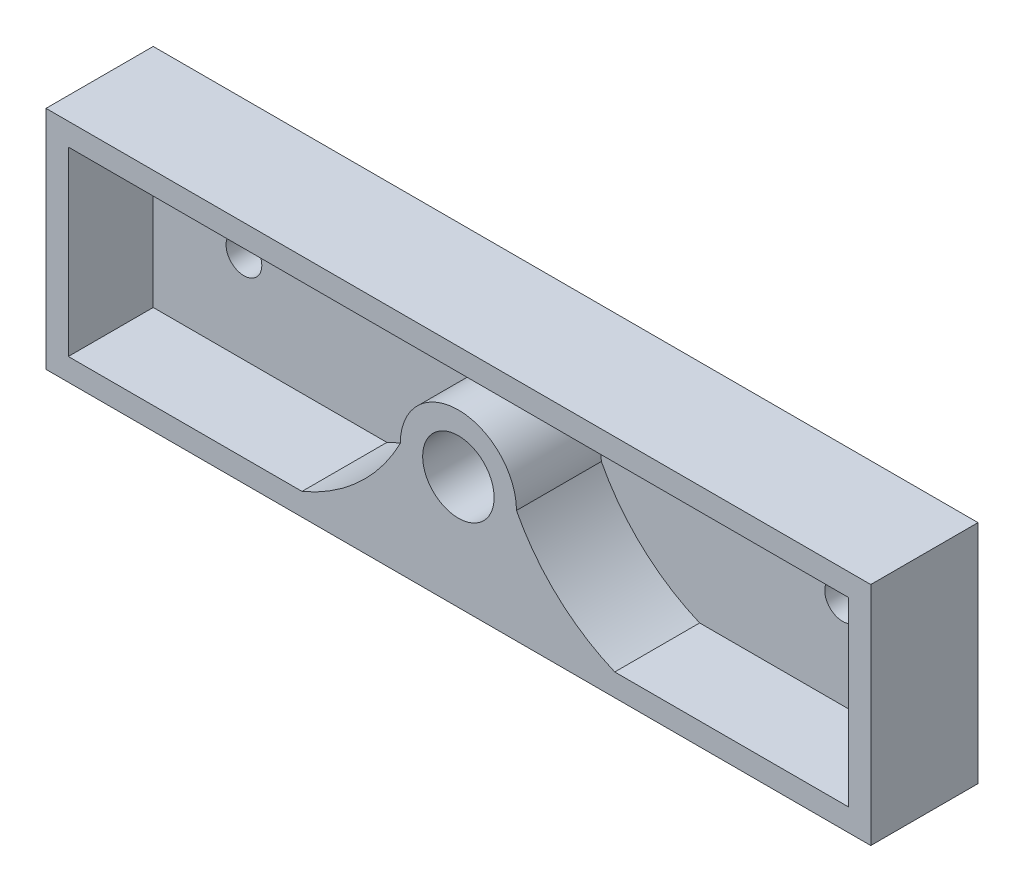
ISO-10303-21;
HEADER;
FILE_DESCRIPTION(('STEP AP214'),'2;1');
FILE_NAME('part.step','',(''),(''),'','','');
FILE_SCHEMA(('AUTOMOTIVE_DESIGN { 1 0 10303 214 1 1 1 1 }'));
ENDSEC;
DATA;
#1=APPLICATION_CONTEXT('core data for automotive mechanical design processes');
#2=APPLICATION_PROTOCOL_DEFINITION('international standard','automotive_design',2000,#1);
#3=PRODUCT_CONTEXT('',#1,'mechanical');
#4=PRODUCT('Part','Part','',(#3));
#5=PRODUCT_RELATED_PRODUCT_CATEGORY('part','',(#4));
#6=PRODUCT_DEFINITION_FORMATION('','',#4);
#7=PRODUCT_DEFINITION_CONTEXT('part definition',#1,'design');
#8=PRODUCT_DEFINITION('design','',#6,#7);
#9=PRODUCT_DEFINITION_SHAPE('','',#8);
#10=(LENGTH_UNIT() NAMED_UNIT(*) SI_UNIT(.MILLI.,.METRE.));
#11=(NAMED_UNIT(*) PLANE_ANGLE_UNIT() SI_UNIT($,.RADIAN.));
#12=(NAMED_UNIT(*) SI_UNIT($,.STERADIAN.) SOLID_ANGLE_UNIT());
#13=UNCERTAINTY_MEASURE_WITH_UNIT(LENGTH_MEASURE(1.E-05),#10,'distance_accuracy_value','');
#14=(GEOMETRIC_REPRESENTATION_CONTEXT(3) GLOBAL_UNCERTAINTY_ASSIGNED_CONTEXT((#13)) GLOBAL_UNIT_ASSIGNED_CONTEXT((#10,
#11,#12)) REPRESENTATION_CONTEXT('',''));
#15=CARTESIAN_POINT('',(0.,0.,0.));
#16=DIRECTION('',(0.,0.,1.));
#17=DIRECTION('',(1.,0.,0.));
#18=AXIS2_PLACEMENT_3D('',#15,#16,#17);
#19=CARTESIAN_POINT('',(0.,2.5,12.));
#20=DIRECTION('',(0.,1.,0.));
#21=DIRECTION('',(0.,0.,1.));
#22=AXIS2_PLACEMENT_3D('',#19,#20,#21);
#23=PLANE('',#22);
#24=DIRECTION('',(1.,0.,0.));
#25=VECTOR('',#24,1.);
#26=CARTESIAN_POINT('',(0.,2.5,2.5));
#27=LINE('',#26,#25);
#28=CARTESIAN_POINT('',(63.65,2.5,2.5));
#29=VERTEX_POINT('',#28);
#30=CARTESIAN_POINT('',(89.8,2.5,2.5));
#31=VERTEX_POINT('',#30);
#32=EDGE_CURVE('E178',#29,#31,#27,.T.);
#33=ORIENTED_EDGE('',*,*,#32,.F.);
#34=DIRECTION('',(0.,0.,-1.));
#35=VECTOR('',#34,1.);
#36=CARTESIAN_POINT('',(63.65,2.5,50.7585151934385));
#37=LINE('',#36,#35);
#38=CARTESIAN_POINT('',(63.65,2.5,12.));
#39=VERTEX_POINT('',#38);
#40=EDGE_CURVE('E50',#39,#29,#37,.T.);
#41=ORIENTED_EDGE('',*,*,#40,.F.);
#42=DIRECTION('',(1.,0.,0.));
#43=VECTOR('',#42,1.);
#44=CARTESIAN_POINT('',(0.,2.5,12.));
#45=LINE('',#44,#43);
#46=CARTESIAN_POINT('',(89.8,2.5,12.));
#47=VERTEX_POINT('',#46);
#48=EDGE_CURVE('E201',#39,#47,#45,.T.);
#49=ORIENTED_EDGE('',*,*,#48,.T.);
#50=DIRECTION('',(0.,0.,-1.));
#51=VECTOR('',#50,1.);
#52=CARTESIAN_POINT('',(89.8,2.5,12.));
#53=LINE('',#52,#51);
#54=EDGE_CURVE('E183',#47,#31,#53,.T.);
#55=ORIENTED_EDGE('',*,*,#54,.T.);
#56=EDGE_LOOP('',(#33,#41,#49,#55));
#57=FACE_BOUND('',#56,.T.);
#58=ADVANCED_FACE('F35',(#57),#23,.T.);
#59=CARTESIAN_POINT('',(2.5,2.5,12.));
#60=VERTEX_POINT('',#59);
#61=CARTESIAN_POINT('',(28.65,2.5,12.));
#62=VERTEX_POINT('',#61);
#63=EDGE_CURVE('E58',#60,#62,#45,.T.);
#64=ORIENTED_EDGE('',*,*,#63,.T.);
#65=DIRECTION('',(0.,0.,-1.));
#66=VECTOR('',#65,1.);
#67=CARTESIAN_POINT('',(28.65,2.5,50.7585151934385));
#68=LINE('',#67,#66);
#69=CARTESIAN_POINT('',(28.65,2.5,2.5));
#70=VERTEX_POINT('',#69);
#71=EDGE_CURVE('E152',#62,#70,#68,.T.);
#72=ORIENTED_EDGE('',*,*,#71,.T.);
#73=CARTESIAN_POINT('',(2.5,2.5,2.5));
#74=VERTEX_POINT('',#73);
#75=EDGE_CURVE('E189',#74,#70,#27,.T.);
#76=ORIENTED_EDGE('',*,*,#75,.F.);
#77=DIRECTION('',(0.,0.,-1.));
#78=VECTOR('',#77,1.);
#79=CARTESIAN_POINT('',(2.5,2.5,12.));
#80=LINE('',#79,#78);
#81=EDGE_CURVE('E179',#60,#74,#80,.T.);
#82=ORIENTED_EDGE('',*,*,#81,.F.);
#83=EDGE_LOOP('',(#64,#72,#76,#82));
#84=FACE_BOUND('',#83,.T.);
#85=ADVANCED_FACE('F257',(#84),#23,.T.);
#86=CARTESIAN_POINT('',(0.,0.,2.5));
#87=DIRECTION('',(0.,0.,-1.));
#88=DIRECTION('',(-1.,0.,0.));
#89=AXIS2_PLACEMENT_3D('',#86,#87,#88);
#90=PLANE('',#89);
#91=CARTESIAN_POINT('',(12.65,12.65,2.5));
#92=DIRECTION('',(0.,0.,1.));
#93=DIRECTION('',(1.,0.,0.));
#94=AXIS2_PLACEMENT_3D('',#91,#92,#93);
#95=CIRCLE('',#94,2.);
#96=CARTESIAN_POINT('',(14.65,12.65,2.5));
#97=VERTEX_POINT('',#96);
#98=EDGE_CURVE('E161',#97,#97,#95,.T.);
#99=ORIENTED_EDGE('',*,*,#98,.F.);
#100=EDGE_LOOP('',(#99));
#101=FACE_BOUND('',#100,.T.);
#102=CARTESIAN_POINT('',(79.65,12.65,2.5));
#103=DIRECTION('',(0.,0.,1.));
#104=DIRECTION('',(1.,0.,0.));
#105=AXIS2_PLACEMENT_3D('',#102,#103,#104);
#106=CIRCLE('',#105,2.);
#107=CARTESIAN_POINT('',(81.65,12.65,2.5));
#108=VERTEX_POINT('',#107);
#109=EDGE_CURVE('E160',#108,#108,#106,.T.);
#110=ORIENTED_EDGE('',*,*,#109,.F.);
#111=EDGE_LOOP('',(#110));
#112=FACE_BOUND('',#111,.T.);
#113=CARTESIAN_POINT('',(72.1502292013453,22.7476621886501,2.5));
#114=DIRECTION('',(0.,0.,-1.));
#115=DIRECTION('',(1.,0.,0.));
#116=AXIS2_PLACEMENT_3D('',#113,#114,#115);
#117=CIRCLE('',#116,21.9595473674002);
#118=CARTESIAN_POINT('',(52.65,12.65,2.5));
#119=VERTEX_POINT('',#118);
#120=EDGE_CURVE('E140',#29,#119,#117,.T.);
#121=ORIENTED_EDGE('',*,*,#120,.F.);
#122=ORIENTED_EDGE('',*,*,#32,.T.);
#123=DIRECTION('',(0.,1.,0.));
#124=VECTOR('',#123,1.);
#125=CARTESIAN_POINT('',(89.8,0.,2.5));
#126=LINE('',#125,#124);
#127=CARTESIAN_POINT('',(89.8,22.8,2.5));
#128=VERTEX_POINT('',#127);
#129=EDGE_CURVE('E191',#31,#128,#126,.T.);
#130=ORIENTED_EDGE('',*,*,#129,.T.);
#131=DIRECTION('',(-1.,0.,0.));
#132=VECTOR('',#131,1.);
#133=CARTESIAN_POINT('',(0.,22.8,2.5));
#134=LINE('',#133,#132);
#135=CARTESIAN_POINT('',(2.5,22.8,2.5));
#136=VERTEX_POINT('',#135);
#137=EDGE_CURVE('E195',#128,#136,#134,.T.);
#138=ORIENTED_EDGE('',*,*,#137,.T.);
#139=DIRECTION('',(0.,-1.,0.));
#140=VECTOR('',#139,1.);
#141=CARTESIAN_POINT('',(2.5,0.,2.5));
#142=LINE('',#141,#140);
#143=EDGE_CURVE('E175',#136,#74,#142,.T.);
#144=ORIENTED_EDGE('',*,*,#143,.T.);
#145=ORIENTED_EDGE('',*,*,#75,.T.);
#146=CARTESIAN_POINT('',(20.1497707986547,22.7476621886501,2.5));
#147=DIRECTION('',(0.,0.,-1.));
#148=DIRECTION('',(-1.,0.,0.));
#149=AXIS2_PLACEMENT_3D('',#146,#147,#148);
#150=CIRCLE('',#149,21.9595473674002);
#151=CARTESIAN_POINT('',(39.65,12.65,2.5));
#152=VERTEX_POINT('',#151);
#153=EDGE_CURVE('E149',#152,#70,#150,.T.);
#154=ORIENTED_EDGE('',*,*,#153,.F.);
#155=CARTESIAN_POINT('',(46.15,12.65,2.5));
#156=DIRECTION('',(0.,0.,1.));
#157=DIRECTION('',(1.,0.,0.));
#158=AXIS2_PLACEMENT_3D('',#155,#156,#157);
#159=CIRCLE('',#158,6.5);
#160=EDGE_CURVE('E146',#119,#152,#159,.T.);
#161=ORIENTED_EDGE('',*,*,#160,.F.);
#162=EDGE_LOOP('',(#121,#122,#130,#138,#144,#145,#154,#161));
#163=FACE_BOUND('',#162,.T.);
#164=ADVANCED_FACE('F262',(#101,#112,#163),#90,.F.);
#165=CARTESIAN_POINT('',(0.,0.,12.));
#166=DIRECTION('',(0.,0.,-1.));
#167=DIRECTION('',(-1.,0.,0.));
#168=AXIS2_PLACEMENT_3D('',#165,#166,#167);
#169=PLANE('',#168);
#170=DIRECTION('',(0.,-1.,0.));
#171=VECTOR('',#170,1.);
#172=CARTESIAN_POINT('',(0.,0.,12.));
#173=LINE('',#172,#171);
#174=CARTESIAN_POINT('',(0.,25.3,12.));
#175=VERTEX_POINT('',#174);
#176=CARTESIAN_POINT('',(0.,0.,12.));
#177=VERTEX_POINT('',#176);
#178=EDGE_CURVE('E207',#175,#177,#173,.T.);
#179=ORIENTED_EDGE('',*,*,#178,.T.);
#180=DIRECTION('',(1.,0.,0.));
#181=VECTOR('',#180,1.);
#182=CARTESIAN_POINT('',(0.,0.,12.));
#183=LINE('',#182,#181);
#184=CARTESIAN_POINT('',(92.3,0.,12.));
#185=VERTEX_POINT('',#184);
#186=EDGE_CURVE('E210',#177,#185,#183,.T.);
#187=ORIENTED_EDGE('',*,*,#186,.T.);
#188=DIRECTION('',(0.,1.,0.));
#189=VECTOR('',#188,1.);
#190=CARTESIAN_POINT('',(92.3,0.,12.));
#191=LINE('',#190,#189);
#192=CARTESIAN_POINT('',(92.3,25.3,12.));
#193=VERTEX_POINT('',#192);
#194=EDGE_CURVE('E213',#185,#193,#191,.T.);
#195=ORIENTED_EDGE('',*,*,#194,.T.);
#196=DIRECTION('',(-1.,0.,0.));
#197=VECTOR('',#196,1.);
#198=CARTESIAN_POINT('',(0.,25.3,12.));
#199=LINE('',#198,#197);
#200=EDGE_CURVE('E215',#193,#175,#199,.T.);
#201=ORIENTED_EDGE('',*,*,#200,.T.);
#202=EDGE_LOOP('',(#179,#187,#195,#201));
#203=FACE_BOUND('',#202,.T.);
#204=DIRECTION('',(0.,-1.,0.));
#205=VECTOR('',#204,1.);
#206=CARTESIAN_POINT('',(2.5,0.,12.));
#207=LINE('',#206,#205);
#208=CARTESIAN_POINT('',(2.5,22.8,12.));
#209=VERTEX_POINT('',#208);
#210=EDGE_CURVE('E199',#209,#60,#207,.T.);
#211=ORIENTED_EDGE('',*,*,#210,.F.);
#212=DIRECTION('',(-1.,0.,0.));
#213=VECTOR('',#212,1.);
#214=CARTESIAN_POINT('',(0.,22.8,12.));
#215=LINE('',#214,#213);
#216=CARTESIAN_POINT('',(89.8,22.8,12.));
#217=VERTEX_POINT('',#216);
#218=EDGE_CURVE('E188',#217,#209,#215,.T.);
#219=ORIENTED_EDGE('',*,*,#218,.F.);
#220=DIRECTION('',(0.,1.,0.));
#221=VECTOR('',#220,1.);
#222=CARTESIAN_POINT('',(89.8,0.,12.));
#223=LINE('',#222,#221);
#224=EDGE_CURVE('E203',#47,#217,#223,.T.);
#225=ORIENTED_EDGE('',*,*,#224,.F.);
#226=ORIENTED_EDGE('',*,*,#48,.F.);
#227=CARTESIAN_POINT('',(72.1502292013453,22.7476621886501,12.));
#228=DIRECTION('',(0.,0.,-1.));
#229=DIRECTION('',(-1.,0.,0.));
#230=AXIS2_PLACEMENT_3D('',#227,#228,#229);
#231=CIRCLE('',#230,21.9595473674002);
#232=CARTESIAN_POINT('',(52.65,12.65,12.));
#233=VERTEX_POINT('',#232);
#234=EDGE_CURVE('E135',#233,#39,#231,.F.);
#235=ORIENTED_EDGE('',*,*,#234,.F.);
#236=CARTESIAN_POINT('',(46.15,12.65,12.));
#237=DIRECTION('',(0.,0.,-1.));
#238=DIRECTION('',(-1.,0.,0.));
#239=AXIS2_PLACEMENT_3D('',#236,#237,#238);
#240=CIRCLE('',#239,6.5);
#241=CARTESIAN_POINT('',(39.65,12.65,12.));
#242=VERTEX_POINT('',#241);
#243=EDGE_CURVE('E126',#242,#233,#240,.T.);
#244=ORIENTED_EDGE('',*,*,#243,.F.);
#245=CARTESIAN_POINT('',(20.1497707986547,22.7476621886501,12.));
#246=DIRECTION('',(0.,0.,-1.));
#247=DIRECTION('',(-1.,0.,0.));
#248=AXIS2_PLACEMENT_3D('',#245,#246,#247);
#249=CIRCLE('',#248,21.9595473674002);
#250=EDGE_CURVE('E132',#62,#242,#249,.F.);
#251=ORIENTED_EDGE('',*,*,#250,.F.);
#252=ORIENTED_EDGE('',*,*,#63,.F.);
#253=EDGE_LOOP('',(#211,#219,#225,#226,#235,#244,#251,#252));
#254=FACE_BOUND('',#253,.T.);
#255=CARTESIAN_POINT('',(46.15,12.65,12.));
#256=DIRECTION('',(0.,0.,-1.));
#257=DIRECTION('',(-1.,0.,0.));
#258=AXIS2_PLACEMENT_3D('',#255,#256,#257);
#259=CIRCLE('',#258,4.);
#260=CARTESIAN_POINT('',(42.15,12.65,12.));
#261=VERTEX_POINT('',#260);
#262=EDGE_CURVE('E157',#261,#261,#259,.T.);
#263=ORIENTED_EDGE('',*,*,#262,.T.);
#264=EDGE_LOOP('',(#263));
#265=FACE_BOUND('',#264,.T.);
#266=ADVANCED_FACE('F129',(#203,#254,#265),#169,.F.);
#267=CARTESIAN_POINT('',(0.,0.,12.));
#268=DIRECTION('',(1.,0.,0.));
#269=DIRECTION('',(0.,0.,-1.));
#270=AXIS2_PLACEMENT_3D('',#267,#268,#269);
#271=PLANE('',#270);
#272=DIRECTION('',(0.,-1.,0.));
#273=VECTOR('',#272,1.);
#274=CARTESIAN_POINT('',(0.,0.,0.));
#275=LINE('',#274,#273);
#276=CARTESIAN_POINT('',(0.,25.3,0.));
#277=VERTEX_POINT('',#276);
#278=CARTESIAN_POINT('',(0.,0.,0.));
#279=VERTEX_POINT('',#278);
#280=EDGE_CURVE('E182',#277,#279,#275,.T.);
#281=ORIENTED_EDGE('',*,*,#280,.T.);
#282=DIRECTION('',(0.,0.,-1.));
#283=VECTOR('',#282,1.);
#284=CARTESIAN_POINT('',(0.,0.,12.));
#285=LINE('',#284,#283);
#286=EDGE_CURVE('E11',#177,#279,#285,.T.);
#287=ORIENTED_EDGE('',*,*,#286,.F.);
#288=ORIENTED_EDGE('',*,*,#178,.F.);
#289=DIRECTION('',(0.,0.,-1.));
#290=VECTOR('',#289,1.);
#291=CARTESIAN_POINT('',(0.,25.3,12.));
#292=LINE('',#291,#290);
#293=EDGE_CURVE('E217',#175,#277,#292,.T.);
#294=ORIENTED_EDGE('',*,*,#293,.T.);
#295=EDGE_LOOP('',(#281,#287,#288,#294));
#296=FACE_BOUND('',#295,.T.);
#297=ADVANCED_FACE('F37',(#296),#271,.F.);
#298=CARTESIAN_POINT('',(0.,0.,12.));
#299=DIRECTION('',(0.,1.,0.));
#300=DIRECTION('',(0.,0.,1.));
#301=AXIS2_PLACEMENT_3D('',#298,#299,#300);
#302=PLANE('',#301);
#303=DIRECTION('',(1.,0.,0.));
#304=VECTOR('',#303,1.);
#305=CARTESIAN_POINT('',(0.,0.,0.));
#306=LINE('',#305,#304);
#307=CARTESIAN_POINT('',(92.3,0.,0.));
#308=VERTEX_POINT('',#307);
#309=EDGE_CURVE('E220',#279,#308,#306,.T.);
#310=ORIENTED_EDGE('',*,*,#309,.T.);
#311=DIRECTION('',(0.,0.,-1.));
#312=VECTOR('',#311,1.);
#313=CARTESIAN_POINT('',(92.3,0.,12.));
#314=LINE('',#313,#312);
#315=EDGE_CURVE('E43',#185,#308,#314,.T.);
#316=ORIENTED_EDGE('',*,*,#315,.F.);
#317=ORIENTED_EDGE('',*,*,#186,.F.);
#318=ORIENTED_EDGE('',*,*,#286,.T.);
#319=EDGE_LOOP('',(#310,#316,#317,#318));
#320=FACE_BOUND('',#319,.T.);
#321=ADVANCED_FACE('F249',(#320),#302,.F.);
#322=CARTESIAN_POINT('',(92.3,0.,12.));
#323=DIRECTION('',(-1.,0.,0.));
#324=DIRECTION('',(0.,0.,1.));
#325=AXIS2_PLACEMENT_3D('',#322,#323,#324);
#326=PLANE('',#325);
#327=DIRECTION('',(0.,1.,0.));
#328=VECTOR('',#327,1.);
#329=CARTESIAN_POINT('',(92.3,0.,0.));
#330=LINE('',#329,#328);
#331=CARTESIAN_POINT('',(92.3,25.3,0.));
#332=VERTEX_POINT('',#331);
#333=EDGE_CURVE('E222',#308,#332,#330,.T.);
#334=ORIENTED_EDGE('',*,*,#333,.T.);
#335=DIRECTION('',(0.,0.,-1.));
#336=VECTOR('',#335,1.);
#337=CARTESIAN_POINT('',(92.3,25.3,12.));
#338=LINE('',#337,#336);
#339=EDGE_CURVE('E227',#193,#332,#338,.T.);
#340=ORIENTED_EDGE('',*,*,#339,.F.);
#341=ORIENTED_EDGE('',*,*,#194,.F.);
#342=ORIENTED_EDGE('',*,*,#315,.T.);
#343=EDGE_LOOP('',(#334,#340,#341,#342));
#344=FACE_BOUND('',#343,.T.);
#345=ADVANCED_FACE('F234',(#344),#326,.F.);
#346=CARTESIAN_POINT('',(0.,25.3,12.));
#347=DIRECTION('',(0.,-1.,0.));
#348=DIRECTION('',(0.,0.,-1.));
#349=AXIS2_PLACEMENT_3D('',#346,#347,#348);
#350=PLANE('',#349);
#351=DIRECTION('',(-1.,0.,0.));
#352=VECTOR('',#351,1.);
#353=CARTESIAN_POINT('',(0.,25.3,0.));
#354=LINE('',#353,#352);
#355=EDGE_CURVE('E211',#332,#277,#354,.T.);
#356=ORIENTED_EDGE('',*,*,#355,.T.);
#357=ORIENTED_EDGE('',*,*,#293,.F.);
#358=ORIENTED_EDGE('',*,*,#200,.F.);
#359=ORIENTED_EDGE('',*,*,#339,.T.);
#360=EDGE_LOOP('',(#356,#357,#358,#359));
#361=FACE_BOUND('',#360,.T.);
#362=ADVANCED_FACE('F243',(#361),#350,.F.);
#363=CARTESIAN_POINT('',(0.,0.,0.));
#364=DIRECTION('',(0.,0.,-1.));
#365=DIRECTION('',(-1.,0.,0.));
#366=AXIS2_PLACEMENT_3D('',#363,#364,#365);
#367=PLANE('',#366);
#368=CARTESIAN_POINT('',(79.65,12.65,0.));
#369=DIRECTION('',(0.,0.,-1.));
#370=DIRECTION('',(-1.,0.,0.));
#371=AXIS2_PLACEMENT_3D('',#368,#369,#370);
#372=CIRCLE('',#371,2.);
#373=CARTESIAN_POINT('',(77.65,12.65,0.));
#374=VERTEX_POINT('',#373);
#375=EDGE_CURVE('E172',#374,#374,#372,.T.);
#376=ORIENTED_EDGE('',*,*,#375,.F.);
#377=EDGE_LOOP('',(#376));
#378=FACE_BOUND('',#377,.T.);
#379=CARTESIAN_POINT('',(12.65,12.65,0.));
#380=DIRECTION('',(0.,0.,-1.));
#381=DIRECTION('',(-1.,0.,0.));
#382=AXIS2_PLACEMENT_3D('',#379,#380,#381);
#383=CIRCLE('',#382,2.);
#384=CARTESIAN_POINT('',(10.65,12.65,0.));
#385=VERTEX_POINT('',#384);
#386=EDGE_CURVE('E169',#385,#385,#383,.T.);
#387=ORIENTED_EDGE('',*,*,#386,.F.);
#388=EDGE_LOOP('',(#387));
#389=FACE_BOUND('',#388,.T.);
#390=CARTESIAN_POINT('',(46.15,12.65,0.));
#391=DIRECTION('',(0.,0.,-1.));
#392=DIRECTION('',(-1.,0.,0.));
#393=AXIS2_PLACEMENT_3D('',#390,#391,#392);
#394=CIRCLE('',#393,4.);
#395=CARTESIAN_POINT('',(42.15,12.65,0.));
#396=VERTEX_POINT('',#395);
#397=EDGE_CURVE('E164',#396,#396,#394,.T.);
#398=ORIENTED_EDGE('',*,*,#397,.F.);
#399=EDGE_LOOP('',(#398));
#400=FACE_BOUND('',#399,.T.);
#401=ORIENTED_EDGE('',*,*,#280,.F.);
#402=ORIENTED_EDGE('',*,*,#355,.F.);
#403=ORIENTED_EDGE('',*,*,#333,.F.);
#404=ORIENTED_EDGE('',*,*,#309,.F.);
#405=EDGE_LOOP('',(#401,#402,#403,#404));
#406=FACE_BOUND('',#405,.T.);
#407=ADVANCED_FACE('F240',(#378,#389,#400,#406),#367,.T.);
#408=CARTESIAN_POINT('',(2.5,0.,12.));
#409=DIRECTION('',(1.,0.,0.));
#410=DIRECTION('',(0.,0.,-1.));
#411=AXIS2_PLACEMENT_3D('',#408,#409,#410);
#412=PLANE('',#411);
#413=ORIENTED_EDGE('',*,*,#143,.F.);
#414=DIRECTION('',(0.,0.,-1.));
#415=VECTOR('',#414,1.);
#416=CARTESIAN_POINT('',(2.5,22.8,12.));
#417=LINE('',#416,#415);
#418=EDGE_CURVE('E184',#209,#136,#417,.T.);
#419=ORIENTED_EDGE('',*,*,#418,.F.);
#420=ORIENTED_EDGE('',*,*,#210,.T.);
#421=ORIENTED_EDGE('',*,*,#81,.T.);
#422=EDGE_LOOP('',(#413,#419,#420,#421));
#423=FACE_BOUND('',#422,.T.);
#424=ADVANCED_FACE('F265',(#423),#412,.T.);
#425=CARTESIAN_POINT('',(89.8,0.,12.));
#426=DIRECTION('',(-1.,0.,0.));
#427=DIRECTION('',(0.,0.,1.));
#428=AXIS2_PLACEMENT_3D('',#425,#426,#427);
#429=PLANE('',#428);
#430=ORIENTED_EDGE('',*,*,#129,.F.);
#431=ORIENTED_EDGE('',*,*,#54,.F.);
#432=ORIENTED_EDGE('',*,*,#224,.T.);
#433=DIRECTION('',(0.,0.,-1.));
#434=VECTOR('',#433,1.);
#435=CARTESIAN_POINT('',(89.8,22.8,12.));
#436=LINE('',#435,#434);
#437=EDGE_CURVE('E187',#217,#128,#436,.T.);
#438=ORIENTED_EDGE('',*,*,#437,.T.);
#439=EDGE_LOOP('',(#430,#431,#432,#438));
#440=FACE_BOUND('',#439,.T.);
#441=ADVANCED_FACE('F267',(#440),#429,.T.);
#442=CARTESIAN_POINT('',(0.,22.8,12.));
#443=DIRECTION('',(0.,-1.,0.));
#444=DIRECTION('',(0.,0.,-1.));
#445=AXIS2_PLACEMENT_3D('',#442,#443,#444);
#446=PLANE('',#445);
#447=ORIENTED_EDGE('',*,*,#137,.F.);
#448=ORIENTED_EDGE('',*,*,#437,.F.);
#449=ORIENTED_EDGE('',*,*,#218,.T.);
#450=ORIENTED_EDGE('',*,*,#418,.T.);
#451=EDGE_LOOP('',(#447,#448,#449,#450));
#452=FACE_BOUND('',#451,.T.);
#453=ADVANCED_FACE('F270',(#452),#446,.T.);
#454=CARTESIAN_POINT('',(46.15,12.65,-9.5));
#455=DIRECTION('',(0.,0.,1.));
#456=DIRECTION('',(1.,0.,0.));
#457=AXIS2_PLACEMENT_3D('',#454,#455,#456);
#458=CYLINDRICAL_SURFACE('',#457,4.);
#459=ORIENTED_EDGE('',*,*,#397,.T.);
#460=EDGE_LOOP('',(#459));
#461=FACE_BOUND('',#460,.T.);
#462=ORIENTED_EDGE('',*,*,#262,.F.);
#463=EDGE_LOOP('',(#462));
#464=FACE_BOUND('',#463,.T.);
#465=ADVANCED_FACE('F274',(#461,#464),#458,.F.);
#466=CARTESIAN_POINT('',(12.65,12.65,-9.5));
#467=DIRECTION('',(0.,0.,1.));
#468=DIRECTION('',(1.,0.,0.));
#469=AXIS2_PLACEMENT_3D('',#466,#467,#468);
#470=CYLINDRICAL_SURFACE('',#469,2.);
#471=ORIENTED_EDGE('',*,*,#386,.T.);
#472=EDGE_LOOP('',(#471));
#473=FACE_BOUND('',#472,.T.);
#474=ORIENTED_EDGE('',*,*,#98,.T.);
#475=EDGE_LOOP('',(#474));
#476=FACE_BOUND('',#475,.T.);
#477=ADVANCED_FACE('F314',(#473,#476),#470,.F.);
#478=CARTESIAN_POINT('',(79.65,12.65,-9.5));
#479=DIRECTION('',(0.,0.,1.));
#480=DIRECTION('',(1.,0.,0.));
#481=AXIS2_PLACEMENT_3D('',#478,#479,#480);
#482=CYLINDRICAL_SURFACE('',#481,2.);
#483=ORIENTED_EDGE('',*,*,#375,.T.);
#484=EDGE_LOOP('',(#483));
#485=FACE_BOUND('',#484,.T.);
#486=ORIENTED_EDGE('',*,*,#109,.T.);
#487=EDGE_LOOP('',(#486));
#488=FACE_BOUND('',#487,.T.);
#489=ADVANCED_FACE('F322',(#485,#488),#482,.F.);
#490=CARTESIAN_POINT('',(72.1502292013453,22.7476621886501,50.7585151934385));
#491=DIRECTION('',(0.,0.,-1.));
#492=DIRECTION('',(-1.,0.,0.));
#493=AXIS2_PLACEMENT_3D('',#490,#491,#492);
#494=CYLINDRICAL_SURFACE('',#493,21.9595473674002);
#495=DIRECTION('',(0.,0.,-1.));
#496=VECTOR('',#495,1.);
#497=CARTESIAN_POINT('',(52.65,12.65,50.7585151934385));
#498=LINE('',#497,#496);
#499=EDGE_CURVE('E139',#233,#119,#498,.T.);
#500=ORIENTED_EDGE('',*,*,#499,.F.);
#501=ORIENTED_EDGE('',*,*,#234,.T.);
#502=ORIENTED_EDGE('',*,*,#40,.T.);
#503=ORIENTED_EDGE('',*,*,#120,.T.);
#504=EDGE_LOOP('',(#500,#501,#502,#503));
#505=FACE_BOUND('',#504,.T.);
#506=ADVANCED_FACE('F330',(#505),#494,.F.);
#507=CARTESIAN_POINT('',(46.15,12.65,50.7585151934385));
#508=DIRECTION('',(0.,0.,-1.));
#509=DIRECTION('',(-1.,0.,0.));
#510=AXIS2_PLACEMENT_3D('',#507,#508,#509);
#511=CYLINDRICAL_SURFACE('',#510,6.5);
#512=DIRECTION('',(0.,0.,-1.));
#513=VECTOR('',#512,1.);
#514=CARTESIAN_POINT('',(39.65,12.65,50.7585151934385));
#515=LINE('',#514,#513);
#516=EDGE_CURVE('E144',#242,#152,#515,.T.);
#517=ORIENTED_EDGE('',*,*,#516,.F.);
#518=ORIENTED_EDGE('',*,*,#243,.T.);
#519=ORIENTED_EDGE('',*,*,#499,.T.);
#520=ORIENTED_EDGE('',*,*,#160,.T.);
#521=EDGE_LOOP('',(#517,#518,#519,#520));
#522=FACE_BOUND('',#521,.T.);
#523=ADVANCED_FACE('F145',(#522),#511,.T.);
#524=CARTESIAN_POINT('',(20.1497707986547,22.7476621886501,50.7585151934385));
#525=DIRECTION('',(0.,0.,-1.));
#526=DIRECTION('',(-1.,0.,0.));
#527=AXIS2_PLACEMENT_3D('',#524,#525,#526);
#528=CYLINDRICAL_SURFACE('',#527,21.9595473674002);
#529=ORIENTED_EDGE('',*,*,#71,.F.);
#530=ORIENTED_EDGE('',*,*,#250,.T.);
#531=ORIENTED_EDGE('',*,*,#516,.T.);
#532=ORIENTED_EDGE('',*,*,#153,.T.);
#533=EDGE_LOOP('',(#529,#530,#531,#532));
#534=FACE_BOUND('',#533,.T.);
#535=ADVANCED_FACE('F151',(#534),#528,.F.);
#536=CLOSED_SHELL('',(#58,#85,#164,#266,#297,#321,#345,#362,#407,#424,#441,#453,#465,#477,#489,
#506,#523,#535));
#537=MANIFOLD_SOLID_BREP('B2',#536);
#538=ADVANCED_BREP_SHAPE_REPRESENTATION('',(#18,#537),#14);
#539=SHAPE_DEFINITION_REPRESENTATION(#9,#538);
ENDSEC;
END-ISO-10303-21;
